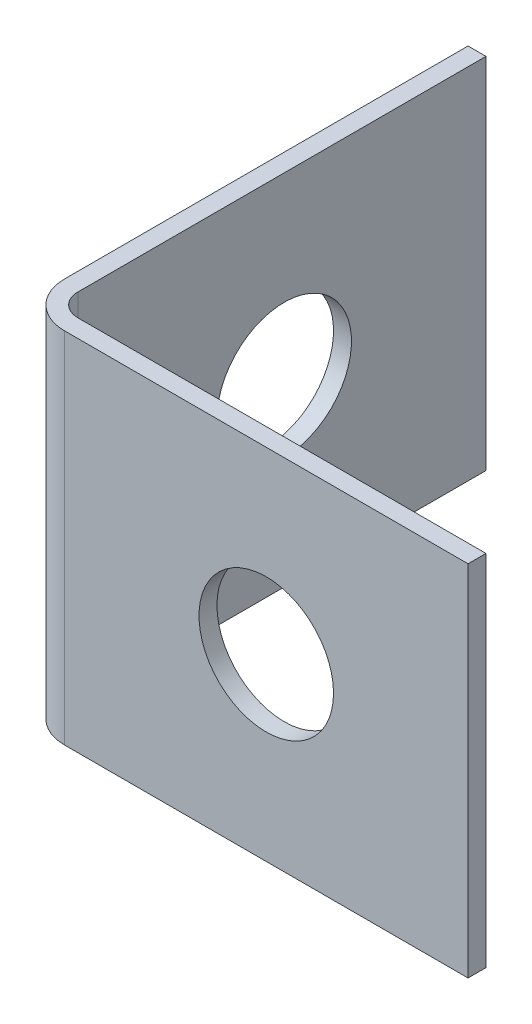
ISO-10303-21;
HEADER;
FILE_DESCRIPTION(('STEP AP214'),'2;1');
FILE_NAME('part.step','',(''),(''),'','','');
FILE_SCHEMA(('AUTOMOTIVE_DESIGN { 1 0 10303 214 1 1 1 1 }'));
ENDSEC;
DATA;
#1=APPLICATION_CONTEXT('core data for automotive mechanical design processes');
#2=APPLICATION_PROTOCOL_DEFINITION('international standard','automotive_design',2000,#1);
#3=PRODUCT_CONTEXT('',#1,'mechanical');
#4=PRODUCT('Part','Part','',(#3));
#5=PRODUCT_RELATED_PRODUCT_CATEGORY('part','',(#4));
#6=PRODUCT_DEFINITION_FORMATION('','',#4);
#7=PRODUCT_DEFINITION_CONTEXT('part definition',#1,'design');
#8=PRODUCT_DEFINITION('design','',#6,#7);
#9=PRODUCT_DEFINITION_SHAPE('','',#8);
#10=(LENGTH_UNIT() NAMED_UNIT(*) SI_UNIT(.MILLI.,.METRE.));
#11=(NAMED_UNIT(*) PLANE_ANGLE_UNIT() SI_UNIT($,.RADIAN.));
#12=(NAMED_UNIT(*) SI_UNIT($,.STERADIAN.) SOLID_ANGLE_UNIT());
#13=UNCERTAINTY_MEASURE_WITH_UNIT(LENGTH_MEASURE(1.E-05),#10,'distance_accuracy_value','');
#14=(GEOMETRIC_REPRESENTATION_CONTEXT(3) GLOBAL_UNCERTAINTY_ASSIGNED_CONTEXT((#13)) GLOBAL_UNIT_ASSIGNED_CONTEXT((#10,
#11,#12)) REPRESENTATION_CONTEXT('',''));
#15=CARTESIAN_POINT('',(0.,0.,0.));
#16=DIRECTION('',(0.,0.,1.));
#17=DIRECTION('',(1.,0.,0.));
#18=AXIS2_PLACEMENT_3D('',#15,#16,#17);
#19=CARTESIAN_POINT('',(0.,1219.2,-1.27));
#20=DIRECTION('',(0.,0.,-1.));
#21=DIRECTION('',(-1.,0.,0.));
#22=AXIS2_PLACEMENT_3D('',#19,#20,#21);
#23=PLANE('',#22);
#24=CARTESIAN_POINT('',(17.4625000000125,12.700000000001,-1.27));
#25=DIRECTION('',(0.,0.,-1.));
#26=DIRECTION('',(-1.,0.,0.));
#27=AXIS2_PLACEMENT_3D('',#24,#25,#26);
#28=CIRCLE('',#27,4.76250000000003);
#29=CARTESIAN_POINT('',(12.7000000000125,12.700000000001,-1.27));
#30=VERTEX_POINT('',#29);
#31=EDGE_CURVE('E143',#30,#30,#28,.F.);
#32=ORIENTED_EDGE('',*,*,#31,.T.);
#33=EDGE_LOOP('',(#32));
#34=FACE_BOUND('',#33,.T.);
#35=DIRECTION('',(0.,-1.,0.));
#36=VECTOR('',#35,1.);
#37=CARTESIAN_POINT('',(2.8575,1219.2,-1.27));
#38=LINE('',#37,#36);
#39=CARTESIAN_POINT('',(2.8575,0.,-1.27));
#40=VERTEX_POINT('',#39);
#41=CARTESIAN_POINT('',(2.8575,25.4000000000001,-1.27));
#42=VERTEX_POINT('',#41);
#43=EDGE_CURVE('E40',#40,#42,#38,.F.);
#44=ORIENTED_EDGE('',*,*,#43,.T.);
#45=DIRECTION('',(-1.,0.,0.));
#46=VECTOR('',#45,1.);
#47=CARTESIAN_POINT('',(31.75,25.4000000000001,-1.27));
#48=LINE('',#47,#46);
#49=CARTESIAN_POINT('',(31.75,25.4000000000001,-1.27));
#50=VERTEX_POINT('',#49);
#51=EDGE_CURVE('E47',#50,#42,#48,.T.);
#52=ORIENTED_EDGE('',*,*,#51,.F.);
#53=DIRECTION('',(0.,-1.,0.));
#54=VECTOR('',#53,1.);
#55=CARTESIAN_POINT('',(31.75,1219.2,-1.27));
#56=LINE('',#55,#54);
#57=CARTESIAN_POINT('',(31.75,0.,-1.27));
#58=VERTEX_POINT('',#57);
#59=EDGE_CURVE('E125',#50,#58,#56,.T.);
#60=ORIENTED_EDGE('',*,*,#59,.T.);
#61=DIRECTION('',(1.,0.,0.));
#62=VECTOR('',#61,1.);
#63=CARTESIAN_POINT('',(0.,0.,-1.27));
#64=LINE('',#63,#62);
#65=EDGE_CURVE('E138',#40,#58,#64,.T.);
#66=ORIENTED_EDGE('',*,*,#65,.F.);
#67=EDGE_LOOP('',(#44,#52,#60,#66));
#68=FACE_BOUND('',#67,.T.);
#69=ADVANCED_FACE('F32',(#34,#68),#23,.T.);
#70=CARTESIAN_POINT('',(1.27,1219.2,0.));
#71=DIRECTION('',(-1.,0.,0.));
#72=DIRECTION('',(0.,0.,1.));
#73=AXIS2_PLACEMENT_3D('',#70,#71,#72);
#74=PLANE('',#73);
#75=CARTESIAN_POINT('',(1.27,12.7,-17.4625));
#76=DIRECTION('',(-1.,0.,0.));
#77=DIRECTION('',(0.,0.,1.));
#78=AXIS2_PLACEMENT_3D('',#75,#76,#77);
#79=CIRCLE('',#78,4.7625);
#80=CARTESIAN_POINT('',(1.27,12.7,-12.7));
#81=VERTEX_POINT('',#80);
#82=EDGE_CURVE('E157',#81,#81,#79,.F.);
#83=ORIENTED_EDGE('',*,*,#82,.F.);
#84=EDGE_LOOP('',(#83));
#85=FACE_BOUND('',#84,.T.);
#86=DIRECTION('',(0.,0.,-1.));
#87=VECTOR('',#86,1.);
#88=CARTESIAN_POINT('',(1.27,25.4000000000001,-2.8575));
#89=LINE('',#88,#87);
#90=CARTESIAN_POINT('',(1.27,25.4000000000001,-2.8575));
#91=VERTEX_POINT('',#90);
#92=CARTESIAN_POINT('',(1.27,25.4000000000001,-31.75));
#93=VERTEX_POINT('',#92);
#94=EDGE_CURVE('E101',#91,#93,#89,.T.);
#95=ORIENTED_EDGE('',*,*,#94,.F.);
#96=DIRECTION('',(0.,-1.,0.));
#97=VECTOR('',#96,1.);
#98=CARTESIAN_POINT('',(1.27,1219.2,-2.8575));
#99=LINE('',#98,#97);
#100=CARTESIAN_POINT('',(1.27,0.,-2.8575));
#101=VERTEX_POINT('',#100);
#102=EDGE_CURVE('E133',#91,#101,#99,.T.);
#103=ORIENTED_EDGE('',*,*,#102,.T.);
#104=DIRECTION('',(0.,0.,-1.));
#105=VECTOR('',#104,1.);
#106=CARTESIAN_POINT('',(1.27,0.,0.));
#107=LINE('',#106,#105);
#108=CARTESIAN_POINT('',(1.27,0.,-31.75));
#109=VERTEX_POINT('',#108);
#110=EDGE_CURVE('E161',#101,#109,#107,.T.);
#111=ORIENTED_EDGE('',*,*,#110,.T.);
#112=DIRECTION('',(0.,-1.,0.));
#113=VECTOR('',#112,1.);
#114=CARTESIAN_POINT('',(1.27,1219.2,-31.75));
#115=LINE('',#114,#113);
#116=EDGE_CURVE('E120',#93,#109,#115,.T.);
#117=ORIENTED_EDGE('',*,*,#116,.F.);
#118=EDGE_LOOP('',(#95,#103,#111,#117));
#119=FACE_BOUND('',#118,.T.);
#120=ADVANCED_FACE('F197',(#85,#119),#74,.F.);
#121=CARTESIAN_POINT('',(0.,1219.2,-31.75));
#122=DIRECTION('',(0.,0.,-1.));
#123=DIRECTION('',(-1.,0.,0.));
#124=AXIS2_PLACEMENT_3D('',#121,#122,#123);
#125=PLANE('',#124);
#126=DIRECTION('',(0.,-1.,0.));
#127=VECTOR('',#126,1.);
#128=CARTESIAN_POINT('',(0.,1219.2,-31.75));
#129=LINE('',#128,#127);
#130=CARTESIAN_POINT('',(0.,25.4000000000001,-31.75));
#131=VERTEX_POINT('',#130);
#132=CARTESIAN_POINT('',(0.,0.,-31.75));
#133=VERTEX_POINT('',#132);
#134=EDGE_CURVE('E110',#131,#133,#129,.T.);
#135=ORIENTED_EDGE('',*,*,#134,.F.);
#136=DIRECTION('',(-1.,0.,0.));
#137=VECTOR('',#136,1.);
#138=CARTESIAN_POINT('',(1.27,25.4000000000001,-31.75));
#139=LINE('',#138,#137);
#140=EDGE_CURVE('E95',#93,#131,#139,.T.);
#141=ORIENTED_EDGE('',*,*,#140,.F.);
#142=ORIENTED_EDGE('',*,*,#116,.T.);
#143=DIRECTION('',(1.,0.,0.));
#144=VECTOR('',#143,1.);
#145=CARTESIAN_POINT('',(0.,0.,-31.75));
#146=LINE('',#145,#144);
#147=EDGE_CURVE('E119',#133,#109,#146,.T.);
#148=ORIENTED_EDGE('',*,*,#147,.F.);
#149=EDGE_LOOP('',(#135,#141,#142,#148));
#150=FACE_BOUND('',#149,.T.);
#151=ADVANCED_FACE('F117',(#150),#125,.T.);
#152=CARTESIAN_POINT('',(0.,1219.2,0.));
#153=DIRECTION('',(-1.,0.,0.));
#154=DIRECTION('',(0.,0.,1.));
#155=AXIS2_PLACEMENT_3D('',#152,#153,#154);
#156=PLANE('',#155);
#157=CARTESIAN_POINT('',(0.,12.7,-17.4625));
#158=DIRECTION('',(-1.,0.,0.));
#159=DIRECTION('',(0.,0.,1.));
#160=AXIS2_PLACEMENT_3D('',#157,#158,#159);
#161=CIRCLE('',#160,4.7625);
#162=CARTESIAN_POINT('',(0.,12.7,-12.7));
#163=VERTEX_POINT('',#162);
#164=EDGE_CURVE('E152',#163,#163,#161,.T.);
#165=ORIENTED_EDGE('',*,*,#164,.F.);
#166=EDGE_LOOP('',(#165));
#167=FACE_BOUND('',#166,.T.);
#168=DIRECTION('',(0.,-1.,0.));
#169=VECTOR('',#168,1.);
#170=CARTESIAN_POINT('',(0.,1219.2,-3.175));
#171=LINE('',#170,#169);
#172=CARTESIAN_POINT('',(0.,0.,-3.175));
#173=VERTEX_POINT('',#172);
#174=CARTESIAN_POINT('',(0.,25.4000000000001,-3.175));
#175=VERTEX_POINT('',#174);
#176=EDGE_CURVE('E113',#173,#175,#171,.F.);
#177=ORIENTED_EDGE('',*,*,#176,.T.);
#178=DIRECTION('',(0.,0.,1.));
#179=VECTOR('',#178,1.);
#180=CARTESIAN_POINT('',(0.,25.4000000000001,-31.75));
#181=LINE('',#180,#179);
#182=EDGE_CURVE('E98',#131,#175,#181,.T.);
#183=ORIENTED_EDGE('',*,*,#182,.F.);
#184=ORIENTED_EDGE('',*,*,#134,.T.);
#185=DIRECTION('',(0.,0.,-1.));
#186=VECTOR('',#185,1.);
#187=CARTESIAN_POINT('',(0.,0.,0.));
#188=LINE('',#187,#186);
#189=EDGE_CURVE('E165',#173,#133,#188,.T.);
#190=ORIENTED_EDGE('',*,*,#189,.F.);
#191=EDGE_LOOP('',(#177,#183,#184,#190));
#192=FACE_BOUND('',#191,.T.);
#193=ADVANCED_FACE('F108',(#167,#192),#156,.T.);
#194=CARTESIAN_POINT('',(0.,1219.2,0.));
#195=DIRECTION('',(0.,0.,-1.));
#196=DIRECTION('',(-1.,0.,0.));
#197=AXIS2_PLACEMENT_3D('',#194,#195,#196);
#198=PLANE('',#197);
#199=CARTESIAN_POINT('',(17.4625000000125,12.700000000001,0.));
#200=DIRECTION('',(0.,0.,1.));
#201=DIRECTION('',(1.,0.,0.));
#202=AXIS2_PLACEMENT_3D('',#199,#200,#201);
#203=CIRCLE('',#202,4.76250000000003);
#204=CARTESIAN_POINT('',(22.2250000000125,12.700000000001,0.));
#205=VERTEX_POINT('',#204);
#206=EDGE_CURVE('E149',#205,#205,#203,.T.);
#207=ORIENTED_EDGE('',*,*,#206,.F.);
#208=EDGE_LOOP('',(#207));
#209=FACE_BOUND('',#208,.T.);
#210=DIRECTION('',(1.,0.,0.));
#211=VECTOR('',#210,1.);
#212=CARTESIAN_POINT('',(3.175,25.4000000000001,0.));
#213=LINE('',#212,#211);
#214=CARTESIAN_POINT('',(3.175,25.4000000000001,0.));
#215=VERTEX_POINT('',#214);
#216=CARTESIAN_POINT('',(31.75,25.4000000000001,0.));
#217=VERTEX_POINT('',#216);
#218=EDGE_CURVE('E186',#215,#217,#213,.T.);
#219=ORIENTED_EDGE('',*,*,#218,.F.);
#220=DIRECTION('',(0.,-1.,0.));
#221=VECTOR('',#220,1.);
#222=CARTESIAN_POINT('',(3.175,0.,0.));
#223=LINE('',#222,#221);
#224=CARTESIAN_POINT('',(3.175,0.,0.));
#225=VERTEX_POINT('',#224);
#226=EDGE_CURVE('E123',#215,#225,#223,.T.);
#227=ORIENTED_EDGE('',*,*,#226,.T.);
#228=DIRECTION('',(1.,0.,0.));
#229=VECTOR('',#228,1.);
#230=CARTESIAN_POINT('',(0.,0.,0.));
#231=LINE('',#230,#229);
#232=CARTESIAN_POINT('',(31.75,0.,0.));
#233=VERTEX_POINT('',#232);
#234=EDGE_CURVE('E167',#225,#233,#231,.T.);
#235=ORIENTED_EDGE('',*,*,#234,.T.);
#236=DIRECTION('',(0.,-1.,0.));
#237=VECTOR('',#236,1.);
#238=CARTESIAN_POINT('',(31.75,1219.2,0.));
#239=LINE('',#238,#237);
#240=EDGE_CURVE('E121',#217,#233,#239,.T.);
#241=ORIENTED_EDGE('',*,*,#240,.F.);
#242=EDGE_LOOP('',(#219,#227,#235,#241));
#243=FACE_BOUND('',#242,.T.);
#244=ADVANCED_FACE('F181',(#209,#243),#198,.F.);
#245=CARTESIAN_POINT('',(31.75,1219.2,0.));
#246=DIRECTION('',(-1.,0.,0.));
#247=DIRECTION('',(0.,0.,1.));
#248=AXIS2_PLACEMENT_3D('',#245,#246,#247);
#249=PLANE('',#248);
#250=DIRECTION('',(0.,0.,-1.));
#251=VECTOR('',#250,1.);
#252=CARTESIAN_POINT('',(31.75,25.4000000000001,0.));
#253=LINE('',#252,#251);
#254=EDGE_CURVE('E145',#217,#50,#253,.T.);
#255=ORIENTED_EDGE('',*,*,#254,.F.);
#256=ORIENTED_EDGE('',*,*,#240,.T.);
#257=DIRECTION('',(0.,0.,-1.));
#258=VECTOR('',#257,1.);
#259=CARTESIAN_POINT('',(31.75,0.,0.));
#260=LINE('',#259,#258);
#261=EDGE_CURVE('E170',#233,#58,#260,.T.);
#262=ORIENTED_EDGE('',*,*,#261,.T.);
#263=ORIENTED_EDGE('',*,*,#59,.F.);
#264=EDGE_LOOP('',(#255,#256,#262,#263));
#265=FACE_BOUND('',#264,.T.);
#266=ADVANCED_FACE('F177',(#265),#249,.F.);
#267=CARTESIAN_POINT('',(3.175,1219.2,-3.175));
#268=DIRECTION('',(0.,1.,0.));
#269=DIRECTION('',(0.,0.,1.));
#270=AXIS2_PLACEMENT_3D('',#267,#268,#269);
#271=CYLINDRICAL_SURFACE('',#270,3.175);
#272=ORIENTED_EDGE('',*,*,#226,.F.);
#273=CARTESIAN_POINT('',(3.175,25.4000000000001,-3.175));
#274=DIRECTION('',(0.,1.,0.));
#275=DIRECTION('',(0.,0.,1.));
#276=AXIS2_PLACEMENT_3D('',#273,#274,#275);
#277=CIRCLE('',#276,3.175);
#278=EDGE_CURVE('E114',#175,#215,#277,.T.);
#279=ORIENTED_EDGE('',*,*,#278,.F.);
#280=ORIENTED_EDGE('',*,*,#176,.F.);
#281=CARTESIAN_POINT('',(3.175,0.,-3.175));
#282=DIRECTION('',(0.,1.,0.));
#283=DIRECTION('',(0.,0.,1.));
#284=AXIS2_PLACEMENT_3D('',#281,#282,#283);
#285=CIRCLE('',#284,3.175);
#286=EDGE_CURVE('E130',#225,#173,#285,.F.);
#287=ORIENTED_EDGE('',*,*,#286,.F.);
#288=EDGE_LOOP('',(#272,#279,#280,#287));
#289=FACE_BOUND('',#288,.T.);
#290=ADVANCED_FACE('F185',(#289),#271,.T.);
#291=CARTESIAN_POINT('',(2.8575,1219.2,-2.8575));
#292=DIRECTION('',(0.,-1.,0.));
#293=DIRECTION('',(0.,0.,-1.));
#294=AXIS2_PLACEMENT_3D('',#291,#292,#293);
#295=CYLINDRICAL_SURFACE('',#294,1.5875);
#296=CARTESIAN_POINT('',(2.8575,25.4000000000001,-2.8575));
#297=DIRECTION('',(0.,-1.,0.));
#298=DIRECTION('',(0.,0.,1.));
#299=AXIS2_PLACEMENT_3D('',#296,#297,#298);
#300=CIRCLE('',#299,1.5875);
#301=EDGE_CURVE('E141',#42,#91,#300,.T.);
#302=ORIENTED_EDGE('',*,*,#301,.F.);
#303=ORIENTED_EDGE('',*,*,#43,.F.);
#304=CARTESIAN_POINT('',(2.8575,0.,-2.8575));
#305=DIRECTION('',(0.,1.,0.));
#306=DIRECTION('',(0.,0.,1.));
#307=AXIS2_PLACEMENT_3D('',#304,#305,#306);
#308=CIRCLE('',#307,1.5875);
#309=EDGE_CURVE('E11',#101,#40,#308,.T.);
#310=ORIENTED_EDGE('',*,*,#309,.F.);
#311=ORIENTED_EDGE('',*,*,#102,.F.);
#312=EDGE_LOOP('',(#302,#303,#310,#311));
#313=FACE_BOUND('',#312,.T.);
#314=ADVANCED_FACE('F34',(#313),#295,.F.);
#315=CARTESIAN_POINT('',(0.,0.,0.));
#316=DIRECTION('',(0.,1.,0.));
#317=DIRECTION('',(0.,0.,1.));
#318=AXIS2_PLACEMENT_3D('',#315,#316,#317);
#319=PLANE('',#318);
#320=ORIENTED_EDGE('',*,*,#234,.F.);
#321=ORIENTED_EDGE('',*,*,#286,.T.);
#322=ORIENTED_EDGE('',*,*,#189,.T.);
#323=ORIENTED_EDGE('',*,*,#147,.T.);
#324=ORIENTED_EDGE('',*,*,#110,.F.);
#325=ORIENTED_EDGE('',*,*,#309,.T.);
#326=ORIENTED_EDGE('',*,*,#65,.T.);
#327=ORIENTED_EDGE('',*,*,#261,.F.);
#328=EDGE_LOOP('',(#320,#321,#322,#323,#324,#325,#326,#327));
#329=FACE_BOUND('',#328,.T.);
#330=ADVANCED_FACE('F176',(#329),#319,.F.);
#331=CARTESIAN_POINT('',(31.751,12.7,-17.4625));
#332=DIRECTION('',(-1.,0.,0.));
#333=DIRECTION('',(0.,0.,1.));
#334=AXIS2_PLACEMENT_3D('',#331,#332,#333);
#335=CYLINDRICAL_SURFACE('',#334,4.7625);
#336=ORIENTED_EDGE('',*,*,#164,.T.);
#337=EDGE_LOOP('',(#336));
#338=FACE_BOUND('',#337,.T.);
#339=ORIENTED_EDGE('',*,*,#82,.T.);
#340=EDGE_LOOP('',(#339));
#341=FACE_BOUND('',#340,.T.);
#342=ADVANCED_FACE('F215',(#338,#341),#335,.F.);
#343=CARTESIAN_POINT('',(17.4625000000125,12.700000000001,-31.751));
#344=DIRECTION('',(0.,0.,1.));
#345=DIRECTION('',(1.,0.,0.));
#346=AXIS2_PLACEMENT_3D('',#343,#344,#345);
#347=CYLINDRICAL_SURFACE('',#346,4.76250000000003);
#348=ORIENTED_EDGE('',*,*,#31,.F.);
#349=EDGE_LOOP('',(#348));
#350=FACE_BOUND('',#349,.T.);
#351=ORIENTED_EDGE('',*,*,#206,.T.);
#352=EDGE_LOOP('',(#351));
#353=FACE_BOUND('',#352,.T.);
#354=ADVANCED_FACE('F218',(#350,#353),#347,.F.);
#355=CARTESIAN_POINT('',(3.175,25.4000000000001,-3.175));
#356=DIRECTION('',(0.,1.,0.));
#357=DIRECTION('',(0.,0.,1.));
#358=AXIS2_PLACEMENT_3D('',#355,#356,#357);
#359=PLANE('',#358);
#360=ORIENTED_EDGE('',*,*,#140,.T.);
#361=ORIENTED_EDGE('',*,*,#182,.T.);
#362=ORIENTED_EDGE('',*,*,#278,.T.);
#363=ORIENTED_EDGE('',*,*,#218,.T.);
#364=ORIENTED_EDGE('',*,*,#254,.T.);
#365=ORIENTED_EDGE('',*,*,#51,.T.);
#366=ORIENTED_EDGE('',*,*,#301,.T.);
#367=ORIENTED_EDGE('',*,*,#94,.T.);
#368=EDGE_LOOP('',(#360,#361,#362,#363,#364,#365,#366,#367));
#369=FACE_BOUND('',#368,.T.);
#370=ADVANCED_FACE('F97',(#369),#359,.T.);
#371=CLOSED_SHELL('',(#69,#120,#151,#193,#244,#266,#290,#314,#330,#342,#354,#370));
#372=MANIFOLD_SOLID_BREP('B2',#371);
#373=ADVANCED_BREP_SHAPE_REPRESENTATION('',(#18,#372),#14);
#374=SHAPE_DEFINITION_REPRESENTATION(#9,#373);
ENDSEC;
END-ISO-10303-21;
